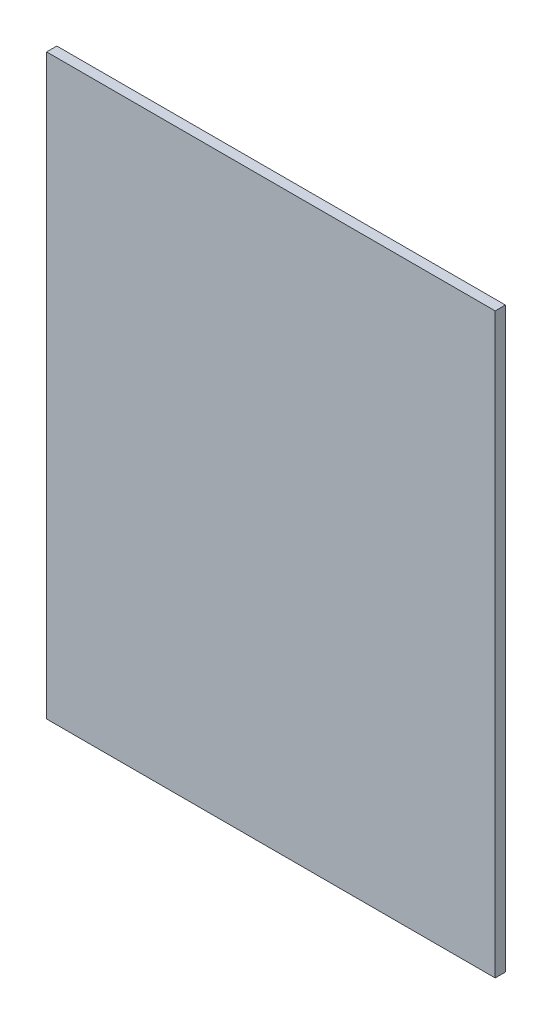
ISO-10303-21;
HEADER;
FILE_DESCRIPTION(('STEP AP214'),'2;1');
FILE_NAME('part.step','',(''),(''),'','','');
FILE_SCHEMA(('AUTOMOTIVE_DESIGN { 1 0 10303 214 1 1 1 1 }'));
ENDSEC;
DATA;
#1=APPLICATION_CONTEXT('core data for automotive mechanical design processes');
#2=APPLICATION_PROTOCOL_DEFINITION('international standard','automotive_design',2000,#1);
#3=PRODUCT_CONTEXT('',#1,'mechanical');
#4=PRODUCT('Part','Part','',(#3));
#5=PRODUCT_RELATED_PRODUCT_CATEGORY('part','',(#4));
#6=PRODUCT_DEFINITION_FORMATION('','',#4);
#7=PRODUCT_DEFINITION_CONTEXT('part definition',#1,'design');
#8=PRODUCT_DEFINITION('design','',#6,#7);
#9=PRODUCT_DEFINITION_SHAPE('','',#8);
#10=(LENGTH_UNIT() NAMED_UNIT(*) SI_UNIT(.MILLI.,.METRE.));
#11=(NAMED_UNIT(*) PLANE_ANGLE_UNIT() SI_UNIT($,.RADIAN.));
#12=(NAMED_UNIT(*) SI_UNIT($,.STERADIAN.) SOLID_ANGLE_UNIT());
#13=UNCERTAINTY_MEASURE_WITH_UNIT(LENGTH_MEASURE(1.E-05),#10,'distance_accuracy_value','');
#14=(GEOMETRIC_REPRESENTATION_CONTEXT(3) GLOBAL_UNCERTAINTY_ASSIGNED_CONTEXT((#13)) GLOBAL_UNIT_ASSIGNED_CONTEXT((#10,
#11,#12)) REPRESENTATION_CONTEXT('',''));
#15=CARTESIAN_POINT('',(0.,0.,0.));
#16=DIRECTION('',(0.,0.,1.));
#17=DIRECTION('',(1.,0.,0.));
#18=AXIS2_PLACEMENT_3D('',#15,#16,#17);
#19=CARTESIAN_POINT('',(-35.82783059637,-62.6342649994093,19.05));
#20=DIRECTION('',(0.,1.,0.));
#21=DIRECTION('',(0.,0.,1.));
#22=AXIS2_PLACEMENT_3D('',#19,#20,#21);
#23=PLANE('',#22);
#24=DIRECTION('',(1.,0.,0.));
#25=VECTOR('',#24,1.);
#26=CARTESIAN_POINT('',(-35.82783059637,-62.6342649994093,0.));
#27=LINE('',#26,#25);
#28=CARTESIAN_POINT('',(-35.82783059637,-62.6342649994093,0.));
#29=VERTEX_POINT('',#28);
#30=CARTESIAN_POINT('',(802.37216940363,-62.6342649994093,0.));
#31=VERTEX_POINT('',#30);
#32=EDGE_CURVE('E106',#29,#31,#27,.T.);
#33=ORIENTED_EDGE('',*,*,#32,.T.);
#34=DIRECTION('',(0.,0.,-1.));
#35=VECTOR('',#34,1.);
#36=CARTESIAN_POINT('',(802.37216940363,-62.6342649994093,19.05));
#37=LINE('',#36,#35);
#38=CARTESIAN_POINT('',(802.37216940363,-62.6342649994093,19.05));
#39=VERTEX_POINT('',#38);
#40=EDGE_CURVE('E11',#39,#31,#37,.T.);
#41=ORIENTED_EDGE('',*,*,#40,.F.);
#42=DIRECTION('',(1.,0.,0.));
#43=VECTOR('',#42,1.);
#44=CARTESIAN_POINT('',(-35.82783059637,-62.6342649994093,19.05));
#45=LINE('',#44,#43);
#46=CARTESIAN_POINT('',(-35.82783059637,-62.6342649994093,19.05));
#47=VERTEX_POINT('',#46);
#48=EDGE_CURVE('E79',#47,#39,#45,.T.);
#49=ORIENTED_EDGE('',*,*,#48,.F.);
#50=DIRECTION('',(0.,0.,-1.));
#51=VECTOR('',#50,1.);
#52=CARTESIAN_POINT('',(-35.82783059637,-62.6342649994093,19.05));
#53=LINE('',#52,#51);
#54=EDGE_CURVE('E102',#47,#29,#53,.T.);
#55=ORIENTED_EDGE('',*,*,#54,.T.);
#56=EDGE_LOOP('',(#33,#41,#49,#55));
#57=FACE_BOUND('',#56,.T.);
#58=ADVANCED_FACE('F39',(#57),#23,.F.);
#59=CARTESIAN_POINT('',(802.37216940363,1016.86573500059,19.05));
#60=DIRECTION('',(1.,0.,0.));
#61=DIRECTION('',(0.,1.,0.));
#62=AXIS2_PLACEMENT_3D('',#59,#60,#61);
#63=PLANE('',#62);
#64=DIRECTION('',(0.,-1.,0.));
#65=VECTOR('',#64,1.);
#66=CARTESIAN_POINT('',(802.37216940363,1016.86573500059,0.));
#67=LINE('',#66,#65);
#68=CARTESIAN_POINT('',(802.37216940363,1016.86573500059,0.));
#69=VERTEX_POINT('',#68);
#70=EDGE_CURVE('E88',#69,#31,#67,.T.);
#71=ORIENTED_EDGE('',*,*,#70,.F.);
#72=DIRECTION('',(0.,0.,-1.));
#73=VECTOR('',#72,1.);
#74=CARTESIAN_POINT('',(802.37216940363,1016.86573500059,19.05));
#75=LINE('',#74,#73);
#76=CARTESIAN_POINT('',(802.37216940363,1016.86573500059,19.05));
#77=VERTEX_POINT('',#76);
#78=EDGE_CURVE('E48',#77,#69,#75,.T.);
#79=ORIENTED_EDGE('',*,*,#78,.F.);
#80=DIRECTION('',(0.,-1.,0.));
#81=VECTOR('',#80,1.);
#82=CARTESIAN_POINT('',(802.37216940363,1016.86573500059,19.05));
#83=LINE('',#82,#81);
#84=EDGE_CURVE('E86',#77,#39,#83,.T.);
#85=ORIENTED_EDGE('',*,*,#84,.T.);
#86=ORIENTED_EDGE('',*,*,#40,.T.);
#87=EDGE_LOOP('',(#71,#79,#85,#86));
#88=FACE_BOUND('',#87,.T.);
#89=ADVANCED_FACE('F85',(#88),#63,.T.);
#90=CARTESIAN_POINT('',(-35.8278305963701,1016.86573500059,19.05));
#91=DIRECTION('',(0.,1.,0.));
#92=DIRECTION('',(0.,0.,1.));
#93=AXIS2_PLACEMENT_3D('',#90,#91,#92);
#94=PLANE('',#93);
#95=DIRECTION('',(1.,0.,0.));
#96=VECTOR('',#95,1.);
#97=CARTESIAN_POINT('',(-35.8278305963701,1016.86573500059,0.));
#98=LINE('',#97,#96);
#99=CARTESIAN_POINT('',(-35.8278305963701,1016.86573500059,0.));
#100=VERTEX_POINT('',#99);
#101=EDGE_CURVE('E112',#100,#69,#98,.T.);
#102=ORIENTED_EDGE('',*,*,#101,.F.);
#103=DIRECTION('',(0.,0.,-1.));
#104=VECTOR('',#103,1.);
#105=CARTESIAN_POINT('',(-35.8278305963701,1016.86573500059,19.05));
#106=LINE('',#105,#104);
#107=CARTESIAN_POINT('',(-35.8278305963701,1016.86573500059,19.05));
#108=VERTEX_POINT('',#107);
#109=EDGE_CURVE('E71',#108,#100,#106,.T.);
#110=ORIENTED_EDGE('',*,*,#109,.F.);
#111=DIRECTION('',(1.,0.,0.));
#112=VECTOR('',#111,1.);
#113=CARTESIAN_POINT('',(-35.8278305963701,1016.86573500059,19.05));
#114=LINE('',#113,#112);
#115=EDGE_CURVE('E95',#108,#77,#114,.T.);
#116=ORIENTED_EDGE('',*,*,#115,.T.);
#117=ORIENTED_EDGE('',*,*,#78,.T.);
#118=EDGE_LOOP('',(#102,#110,#116,#117));
#119=FACE_BOUND('',#118,.T.);
#120=ADVANCED_FACE('F98',(#119),#94,.T.);
#121=CARTESIAN_POINT('',(-35.8278305963701,1016.86573500059,19.05));
#122=DIRECTION('',(1.,0.,0.));
#123=DIRECTION('',(0.,1.,0.));
#124=AXIS2_PLACEMENT_3D('',#121,#122,#123);
#125=PLANE('',#124);
#126=DIRECTION('',(0.,-1.,0.));
#127=VECTOR('',#126,1.);
#128=CARTESIAN_POINT('',(-35.8278305963701,1016.86573500059,0.));
#129=LINE('',#128,#127);
#130=EDGE_CURVE('E74',#100,#29,#129,.T.);
#131=ORIENTED_EDGE('',*,*,#130,.T.);
#132=ORIENTED_EDGE('',*,*,#54,.F.);
#133=DIRECTION('',(0.,-1.,0.));
#134=VECTOR('',#133,1.);
#135=CARTESIAN_POINT('',(-35.8278305963701,1016.86573500059,19.05));
#136=LINE('',#135,#134);
#137=EDGE_CURVE('E56',#108,#47,#136,.T.);
#138=ORIENTED_EDGE('',*,*,#137,.F.);
#139=ORIENTED_EDGE('',*,*,#109,.T.);
#140=EDGE_LOOP('',(#131,#132,#138,#139));
#141=FACE_BOUND('',#140,.T.);
#142=ADVANCED_FACE('F129',(#141),#125,.F.);
#143=CARTESIAN_POINT('',(0.,0.,19.05));
#144=DIRECTION('',(0.,0.,-1.));
#145=DIRECTION('',(-1.,0.,0.));
#146=AXIS2_PLACEMENT_3D('',#143,#144,#145);
#147=PLANE('',#146);
#148=ORIENTED_EDGE('',*,*,#48,.T.);
#149=ORIENTED_EDGE('',*,*,#84,.F.);
#150=ORIENTED_EDGE('',*,*,#115,.F.);
#151=ORIENTED_EDGE('',*,*,#137,.T.);
#152=EDGE_LOOP('',(#148,#149,#150,#151));
#153=FACE_BOUND('',#152,.T.);
#154=ADVANCED_FACE('F94',(#153),#147,.F.);
#155=CARTESIAN_POINT('',(0.,0.,0.));
#156=DIRECTION('',(0.,0.,-1.));
#157=DIRECTION('',(-1.,0.,0.));
#158=AXIS2_PLACEMENT_3D('',#155,#156,#157);
#159=PLANE('',#158);
#160=ORIENTED_EDGE('',*,*,#32,.F.);
#161=ORIENTED_EDGE('',*,*,#130,.F.);
#162=ORIENTED_EDGE('',*,*,#101,.T.);
#163=ORIENTED_EDGE('',*,*,#70,.T.);
#164=EDGE_LOOP('',(#160,#161,#162,#163));
#165=FACE_BOUND('',#164,.T.);
#166=ADVANCED_FACE('F123',(#165),#159,.T.);
#167=CLOSED_SHELL('',(#58,#89,#120,#142,#154,#166));
#168=MANIFOLD_SOLID_BREP('B2',#167);
#169=ADVANCED_BREP_SHAPE_REPRESENTATION('',(#18,#168),#14);
#170=SHAPE_DEFINITION_REPRESENTATION(#9,#169);
ENDSEC;
END-ISO-10303-21;
